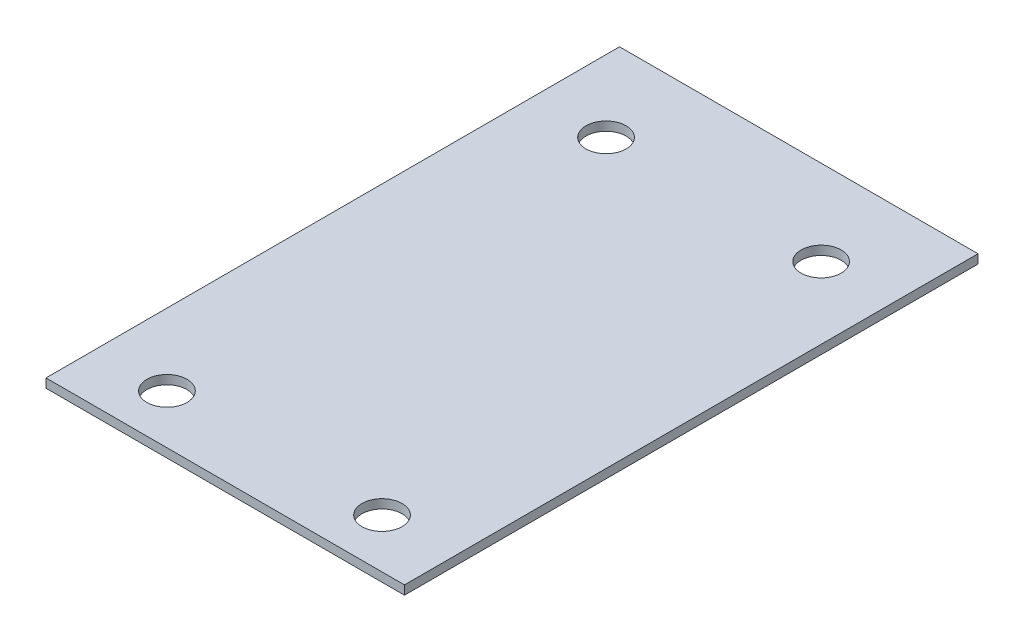
ISO-10303-21;
HEADER;
FILE_DESCRIPTION(('STEP AP214'),'2;1');
FILE_NAME('part.step','',(''),(''),'','','');
FILE_SCHEMA(('AUTOMOTIVE_DESIGN { 1 0 10303 214 1 1 1 1 }'));
ENDSEC;
DATA;
#1=APPLICATION_CONTEXT('core data for automotive mechanical design processes');
#2=APPLICATION_PROTOCOL_DEFINITION('international standard','automotive_design',2000,#1);
#3=PRODUCT_CONTEXT('',#1,'mechanical');
#4=PRODUCT('Part','Part','',(#3));
#5=PRODUCT_RELATED_PRODUCT_CATEGORY('part','',(#4));
#6=PRODUCT_DEFINITION_FORMATION('','',#4);
#7=PRODUCT_DEFINITION_CONTEXT('part definition',#1,'design');
#8=PRODUCT_DEFINITION('design','',#6,#7);
#9=PRODUCT_DEFINITION_SHAPE('','',#8);
#10=(LENGTH_UNIT() NAMED_UNIT(*) SI_UNIT(.MILLI.,.METRE.));
#11=(NAMED_UNIT(*) PLANE_ANGLE_UNIT() SI_UNIT($,.RADIAN.));
#12=(NAMED_UNIT(*) SI_UNIT($,.STERADIAN.) SOLID_ANGLE_UNIT());
#13=UNCERTAINTY_MEASURE_WITH_UNIT(LENGTH_MEASURE(1.E-05),#10,'distance_accuracy_value','');
#14=(GEOMETRIC_REPRESENTATION_CONTEXT(3) GLOBAL_UNCERTAINTY_ASSIGNED_CONTEXT((#13)) GLOBAL_UNIT_ASSIGNED_CONTEXT((#10,
#11,#12)) REPRESENTATION_CONTEXT('',''));
#15=CARTESIAN_POINT('',(0.,0.,0.));
#16=DIRECTION('',(0.,0.,1.));
#17=DIRECTION('',(1.,0.,0.));
#18=AXIS2_PLACEMENT_3D('',#15,#16,#17);
#19=CARTESIAN_POINT('',(0.,3.175,0.));
#20=DIRECTION('',(0.,-1.,0.));
#21=DIRECTION('',(0.,0.,-1.));
#22=AXIS2_PLACEMENT_3D('',#19,#20,#21);
#23=PLANE('',#22);
#24=DIRECTION('',(0.,0.,1.));
#25=VECTOR('',#24,1.);
#26=CARTESIAN_POINT('',(0.,3.175,0.));
#27=LINE('',#26,#25);
#28=CARTESIAN_POINT('',(0.,3.175,-203.2));
#29=VERTEX_POINT('',#28);
#30=CARTESIAN_POINT('',(0.,3.175,0.));
#31=VERTEX_POINT('',#30);
#32=EDGE_CURVE('E85',#29,#31,#27,.T.);
#33=ORIENTED_EDGE('',*,*,#32,.T.);
#34=DIRECTION('',(1.,0.,0.));
#35=VECTOR('',#34,1.);
#36=CARTESIAN_POINT('',(0.,3.175,0.));
#37=LINE('',#36,#35);
#38=CARTESIAN_POINT('',(127.,3.175,0.));
#39=VERTEX_POINT('',#38);
#40=EDGE_CURVE('E80',#31,#39,#37,.T.);
#41=ORIENTED_EDGE('',*,*,#40,.T.);
#42=DIRECTION('',(0.,0.,-1.));
#43=VECTOR('',#42,1.);
#44=CARTESIAN_POINT('',(127.,3.175,0.));
#45=LINE('',#44,#43);
#46=CARTESIAN_POINT('',(127.,3.175,-203.2));
#47=VERTEX_POINT('',#46);
#48=EDGE_CURVE('E83',#39,#47,#45,.T.);
#49=ORIENTED_EDGE('',*,*,#48,.T.);
#50=DIRECTION('',(-1.,0.,0.));
#51=VECTOR('',#50,1.);
#52=CARTESIAN_POINT('',(0.,3.175,-203.2));
#53=LINE('',#52,#51);
#54=EDGE_CURVE('E50',#47,#29,#53,.T.);
#55=ORIENTED_EDGE('',*,*,#54,.T.);
#56=EDGE_LOOP('',(#33,#41,#49,#55));
#57=FACE_BOUND('',#56,.T.);
#58=CARTESIAN_POINT('',(25.4,3.175,-173.0248));
#59=DIRECTION('',(0.,1.,0.));
#60=DIRECTION('',(0.,0.,1.));
#61=AXIS2_PLACEMENT_3D('',#58,#59,#60);
#62=CIRCLE('',#61,7.11200000000003);
#63=CARTESIAN_POINT('',(25.4,3.175,-165.9128));
#64=VERTEX_POINT('',#63);
#65=EDGE_CURVE('E100',#64,#64,#62,.T.);
#66=ORIENTED_EDGE('',*,*,#65,.F.);
#67=EDGE_LOOP('',(#66));
#68=FACE_BOUND('',#67,.T.);
#69=CARTESIAN_POINT('',(25.4,3.175,-17.4498));
#70=DIRECTION('',(0.,1.,0.));
#71=DIRECTION('',(0.,0.,1.));
#72=AXIS2_PLACEMENT_3D('',#69,#70,#71);
#73=CIRCLE('',#72,7.112);
#74=CARTESIAN_POINT('',(25.4,3.175,-10.3378));
#75=VERTEX_POINT('',#74);
#76=EDGE_CURVE('E115',#75,#75,#73,.T.);
#77=ORIENTED_EDGE('',*,*,#76,.F.);
#78=EDGE_LOOP('',(#77));
#79=FACE_BOUND('',#78,.T.);
#80=CARTESIAN_POINT('',(101.6,3.175,-17.4498));
#81=DIRECTION('',(0.,1.,0.));
#82=DIRECTION('',(0.,0.,-1.));
#83=AXIS2_PLACEMENT_3D('',#80,#81,#82);
#84=CIRCLE('',#83,7.11200000000003);
#85=CARTESIAN_POINT('',(101.6,3.175,-24.5618));
#86=VERTEX_POINT('',#85);
#87=EDGE_CURVE('E121',#86,#86,#84,.T.);
#88=ORIENTED_EDGE('',*,*,#87,.F.);
#89=EDGE_LOOP('',(#88));
#90=FACE_BOUND('',#89,.T.);
#91=CARTESIAN_POINT('',(101.6,3.175,-173.0248));
#92=DIRECTION('',(0.,1.,0.));
#93=DIRECTION('',(0.,0.,-1.));
#94=AXIS2_PLACEMENT_3D('',#91,#92,#93);
#95=CIRCLE('',#94,7.11200000000003);
#96=CARTESIAN_POINT('',(101.6,3.175,-180.1368));
#97=VERTEX_POINT('',#96);
#98=EDGE_CURVE('E127',#97,#97,#95,.T.);
#99=ORIENTED_EDGE('',*,*,#98,.F.);
#100=EDGE_LOOP('',(#99));
#101=FACE_BOUND('',#100,.T.);
#102=ADVANCED_FACE('F33',(#57,#68,#79,#90,#101),#23,.F.);
#103=CARTESIAN_POINT('',(0.,0.,0.));
#104=DIRECTION('',(0.,-1.,0.));
#105=DIRECTION('',(0.,0.,-1.));
#106=AXIS2_PLACEMENT_3D('',#103,#104,#105);
#107=PLANE('',#106);
#108=CARTESIAN_POINT('',(101.6,0.,-17.4498));
#109=DIRECTION('',(0.,1.,0.));
#110=DIRECTION('',(0.,0.,-1.));
#111=AXIS2_PLACEMENT_3D('',#108,#109,#110);
#112=CIRCLE('',#111,7.11200000000003);
#113=CARTESIAN_POINT('',(101.6,0.,-24.5618));
#114=VERTEX_POINT('',#113);
#115=EDGE_CURVE('E124',#114,#114,#112,.T.);
#116=ORIENTED_EDGE('',*,*,#115,.T.);
#117=EDGE_LOOP('',(#116));
#118=FACE_BOUND('',#117,.T.);
#119=CARTESIAN_POINT('',(25.4,0.,-173.0248));
#120=DIRECTION('',(0.,1.,0.));
#121=DIRECTION('',(0.,0.,1.));
#122=AXIS2_PLACEMENT_3D('',#119,#120,#121);
#123=CIRCLE('',#122,7.11200000000003);
#124=CARTESIAN_POINT('',(25.4,0.,-165.9128));
#125=VERTEX_POINT('',#124);
#126=EDGE_CURVE('E112',#125,#125,#123,.T.);
#127=ORIENTED_EDGE('',*,*,#126,.T.);
#128=EDGE_LOOP('',(#127));
#129=FACE_BOUND('',#128,.T.);
#130=DIRECTION('',(0.,0.,1.));
#131=VECTOR('',#130,1.);
#132=CARTESIAN_POINT('',(0.,0.,0.));
#133=LINE('',#132,#131);
#134=CARTESIAN_POINT('',(0.,0.,-203.2));
#135=VERTEX_POINT('',#134);
#136=CARTESIAN_POINT('',(0.,0.,0.));
#137=VERTEX_POINT('',#136);
#138=EDGE_CURVE('E97',#135,#137,#133,.T.);
#139=ORIENTED_EDGE('',*,*,#138,.F.);
#140=DIRECTION('',(-1.,0.,0.));
#141=VECTOR('',#140,1.);
#142=CARTESIAN_POINT('',(0.,0.,-203.2));
#143=LINE('',#142,#141);
#144=CARTESIAN_POINT('',(127.,0.,-203.2));
#145=VERTEX_POINT('',#144);
#146=EDGE_CURVE('E73',#145,#135,#143,.T.);
#147=ORIENTED_EDGE('',*,*,#146,.F.);
#148=DIRECTION('',(0.,0.,-1.));
#149=VECTOR('',#148,1.);
#150=CARTESIAN_POINT('',(127.,0.,0.));
#151=LINE('',#150,#149);
#152=CARTESIAN_POINT('',(127.,0.,0.));
#153=VERTEX_POINT('',#152);
#154=EDGE_CURVE('E67',#153,#145,#151,.T.);
#155=ORIENTED_EDGE('',*,*,#154,.F.);
#156=DIRECTION('',(1.,0.,0.));
#157=VECTOR('',#156,1.);
#158=CARTESIAN_POINT('',(0.,0.,0.));
#159=LINE('',#158,#157);
#160=EDGE_CURVE('E89',#137,#153,#159,.T.);
#161=ORIENTED_EDGE('',*,*,#160,.F.);
#162=EDGE_LOOP('',(#139,#147,#155,#161));
#163=FACE_BOUND('',#162,.T.);
#164=CARTESIAN_POINT('',(25.4,0.,-17.4498));
#165=DIRECTION('',(0.,1.,0.));
#166=DIRECTION('',(0.,0.,1.));
#167=AXIS2_PLACEMENT_3D('',#164,#165,#166);
#168=CIRCLE('',#167,7.112);
#169=CARTESIAN_POINT('',(25.4,0.,-10.3378));
#170=VERTEX_POINT('',#169);
#171=EDGE_CURVE('E118',#170,#170,#168,.T.);
#172=ORIENTED_EDGE('',*,*,#171,.T.);
#173=EDGE_LOOP('',(#172));
#174=FACE_BOUND('',#173,.T.);
#175=CARTESIAN_POINT('',(101.6,0.,-173.0248));
#176=DIRECTION('',(0.,1.,0.));
#177=DIRECTION('',(0.,0.,-1.));
#178=AXIS2_PLACEMENT_3D('',#175,#176,#177);
#179=CIRCLE('',#178,7.11200000000003);
#180=CARTESIAN_POINT('',(101.6,0.,-180.1368));
#181=VERTEX_POINT('',#180);
#182=EDGE_CURVE('E130',#181,#181,#179,.T.);
#183=ORIENTED_EDGE('',*,*,#182,.T.);
#184=EDGE_LOOP('',(#183));
#185=FACE_BOUND('',#184,.T.);
#186=ADVANCED_FACE('F108',(#118,#129,#163,#174,#185),#107,.T.);
#187=CARTESIAN_POINT('',(0.,3.175,0.));
#188=DIRECTION('',(1.,0.,0.));
#189=DIRECTION('',(0.,0.,-1.));
#190=AXIS2_PLACEMENT_3D('',#187,#188,#189);
#191=PLANE('',#190);
#192=ORIENTED_EDGE('',*,*,#138,.T.);
#193=DIRECTION('',(0.,-1.,0.));
#194=VECTOR('',#193,1.);
#195=CARTESIAN_POINT('',(0.,3.175,0.));
#196=LINE('',#195,#194);
#197=EDGE_CURVE('E11',#31,#137,#196,.T.);
#198=ORIENTED_EDGE('',*,*,#197,.F.);
#199=ORIENTED_EDGE('',*,*,#32,.F.);
#200=DIRECTION('',(0.,-1.,0.));
#201=VECTOR('',#200,1.);
#202=CARTESIAN_POINT('',(0.,3.175,-203.2));
#203=LINE('',#202,#201);
#204=EDGE_CURVE('E93',#29,#135,#203,.T.);
#205=ORIENTED_EDGE('',*,*,#204,.T.);
#206=EDGE_LOOP('',(#192,#198,#199,#205));
#207=FACE_BOUND('',#206,.T.);
#208=ADVANCED_FACE('F35',(#207),#191,.F.);
#209=CARTESIAN_POINT('',(0.,3.175,0.));
#210=DIRECTION('',(0.,0.,-1.));
#211=DIRECTION('',(-1.,0.,0.));
#212=AXIS2_PLACEMENT_3D('',#209,#210,#211);
#213=PLANE('',#212);
#214=ORIENTED_EDGE('',*,*,#160,.T.);
#215=DIRECTION('',(0.,-1.,0.));
#216=VECTOR('',#215,1.);
#217=CARTESIAN_POINT('',(127.,3.175,0.));
#218=LINE('',#217,#216);
#219=EDGE_CURVE('E42',#39,#153,#218,.T.);
#220=ORIENTED_EDGE('',*,*,#219,.F.);
#221=ORIENTED_EDGE('',*,*,#40,.F.);
#222=ORIENTED_EDGE('',*,*,#197,.T.);
#223=EDGE_LOOP('',(#214,#220,#221,#222));
#224=FACE_BOUND('',#223,.T.);
#225=ADVANCED_FACE('F88',(#224),#213,.F.);
#226=CARTESIAN_POINT('',(127.,3.175,0.));
#227=DIRECTION('',(-1.,0.,0.));
#228=DIRECTION('',(0.,0.,1.));
#229=AXIS2_PLACEMENT_3D('',#226,#227,#228);
#230=PLANE('',#229);
#231=ORIENTED_EDGE('',*,*,#154,.T.);
#232=DIRECTION('',(0.,-1.,0.));
#233=VECTOR('',#232,1.);
#234=CARTESIAN_POINT('',(127.,3.175,-203.2));
#235=LINE('',#234,#233);
#236=EDGE_CURVE('E90',#47,#145,#235,.T.);
#237=ORIENTED_EDGE('',*,*,#236,.F.);
#238=ORIENTED_EDGE('',*,*,#48,.F.);
#239=ORIENTED_EDGE('',*,*,#219,.T.);
#240=EDGE_LOOP('',(#231,#237,#238,#239));
#241=FACE_BOUND('',#240,.T.);
#242=ADVANCED_FACE('F91',(#241),#230,.F.);
#243=CARTESIAN_POINT('',(0.,3.175,-203.2));
#244=DIRECTION('',(0.,0.,1.));
#245=DIRECTION('',(1.,0.,0.));
#246=AXIS2_PLACEMENT_3D('',#243,#244,#245);
#247=PLANE('',#246);
#248=ORIENTED_EDGE('',*,*,#146,.T.);
#249=ORIENTED_EDGE('',*,*,#204,.F.);
#250=ORIENTED_EDGE('',*,*,#54,.F.);
#251=ORIENTED_EDGE('',*,*,#236,.T.);
#252=EDGE_LOOP('',(#248,#249,#250,#251));
#253=FACE_BOUND('',#252,.T.);
#254=ADVANCED_FACE('F105',(#253),#247,.F.);
#255=CARTESIAN_POINT('',(25.4,3.175,-173.0248));
#256=DIRECTION('',(0.,-1.,0.));
#257=DIRECTION('',(0.,0.,-1.));
#258=AXIS2_PLACEMENT_3D('',#255,#256,#257);
#259=CYLINDRICAL_SURFACE('',#258,7.11200000000003);
#260=ORIENTED_EDGE('',*,*,#65,.T.);
#261=EDGE_LOOP('',(#260));
#262=FACE_BOUND('',#261,.T.);
#263=ORIENTED_EDGE('',*,*,#126,.F.);
#264=EDGE_LOOP('',(#263));
#265=FACE_BOUND('',#264,.T.);
#266=ADVANCED_FACE('F147',(#262,#265),#259,.F.);
#267=CARTESIAN_POINT('',(25.4,3.175,-17.4498));
#268=DIRECTION('',(0.,-1.,0.));
#269=DIRECTION('',(0.,0.,-1.));
#270=AXIS2_PLACEMENT_3D('',#267,#268,#269);
#271=CYLINDRICAL_SURFACE('',#270,7.112);
#272=ORIENTED_EDGE('',*,*,#76,.T.);
#273=EDGE_LOOP('',(#272));
#274=FACE_BOUND('',#273,.T.);
#275=ORIENTED_EDGE('',*,*,#171,.F.);
#276=EDGE_LOOP('',(#275));
#277=FACE_BOUND('',#276,.T.);
#278=ADVANCED_FACE('F193',(#274,#277),#271,.F.);
#279=CARTESIAN_POINT('',(101.6,3.175,-17.4498));
#280=DIRECTION('',(0.,-1.,0.));
#281=DIRECTION('',(0.,0.,-1.));
#282=AXIS2_PLACEMENT_3D('',#279,#280,#281);
#283=CYLINDRICAL_SURFACE('',#282,7.11200000000003);
#284=ORIENTED_EDGE('',*,*,#87,.T.);
#285=EDGE_LOOP('',(#284));
#286=FACE_BOUND('',#285,.T.);
#287=ORIENTED_EDGE('',*,*,#115,.F.);
#288=EDGE_LOOP('',(#287));
#289=FACE_BOUND('',#288,.T.);
#290=ADVANCED_FACE('F201',(#286,#289),#283,.F.);
#291=CARTESIAN_POINT('',(101.6,3.175,-173.0248));
#292=DIRECTION('',(0.,-1.,0.));
#293=DIRECTION('',(0.,0.,-1.));
#294=AXIS2_PLACEMENT_3D('',#291,#292,#293);
#295=CYLINDRICAL_SURFACE('',#294,7.11200000000003);
#296=ORIENTED_EDGE('',*,*,#98,.T.);
#297=EDGE_LOOP('',(#296));
#298=FACE_BOUND('',#297,.T.);
#299=ORIENTED_EDGE('',*,*,#182,.F.);
#300=EDGE_LOOP('',(#299));
#301=FACE_BOUND('',#300,.T.);
#302=ADVANCED_FACE('F136',(#298,#301),#295,.F.);
#303=CLOSED_SHELL('',(#102,#186,#208,#225,#242,#254,#266,#278,#290,#302));
#304=MANIFOLD_SOLID_BREP('B2',#303);
#305=ADVANCED_BREP_SHAPE_REPRESENTATION('',(#18,#304),#14);
#306=SHAPE_DEFINITION_REPRESENTATION(#9,#305);
ENDSEC;
END-ISO-10303-21;
